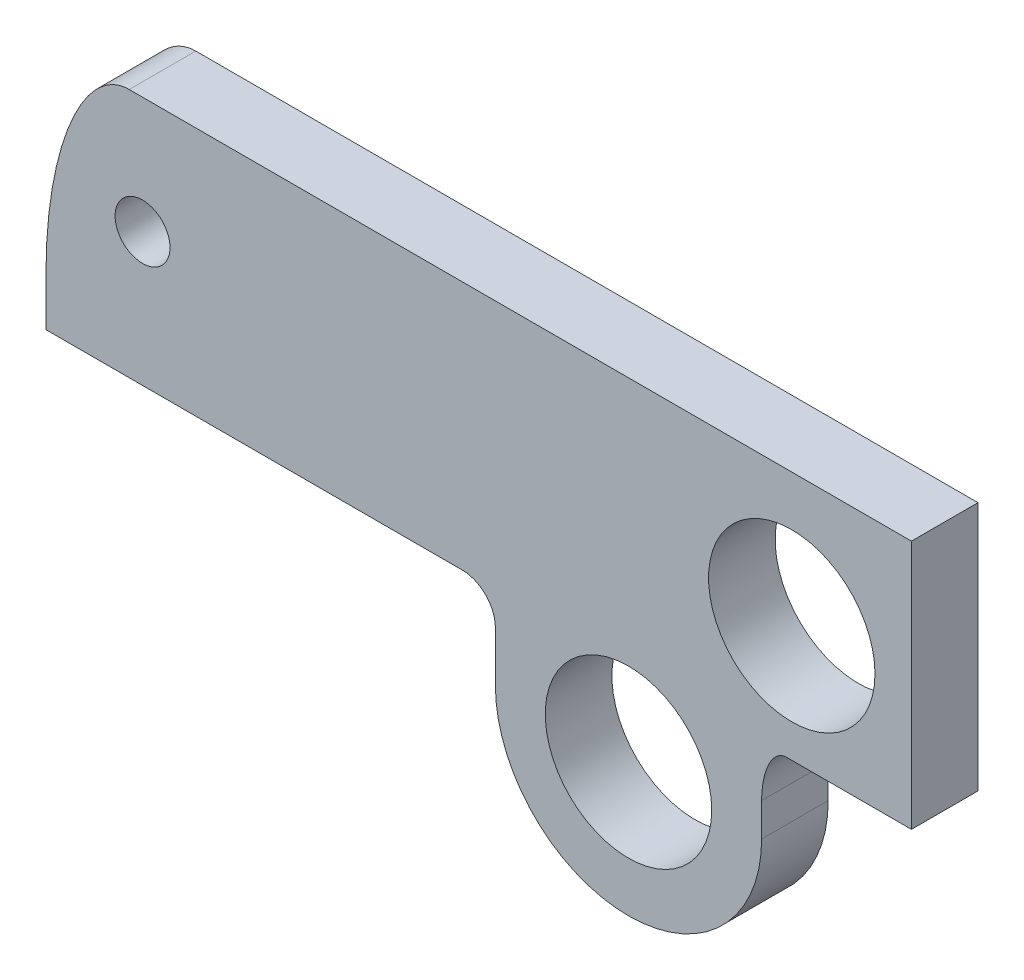
ISO-10303-21;
HEADER;
FILE_DESCRIPTION(('STEP AP214'),'2;1');
FILE_NAME('part.step','',(''),(''),'','','');
FILE_SCHEMA(('AUTOMOTIVE_DESIGN { 1 0 10303 214 1 1 1 1 }'));
ENDSEC;
DATA;
#1=APPLICATION_CONTEXT('core data for automotive mechanical design processes');
#2=APPLICATION_PROTOCOL_DEFINITION('international standard','automotive_design',2000,#1);
#3=PRODUCT_CONTEXT('',#1,'mechanical');
#4=PRODUCT('Part','Part','',(#3));
#5=PRODUCT_RELATED_PRODUCT_CATEGORY('part','',(#4));
#6=PRODUCT_DEFINITION_FORMATION('','',#4);
#7=PRODUCT_DEFINITION_CONTEXT('part definition',#1,'design');
#8=PRODUCT_DEFINITION('design','',#6,#7);
#9=PRODUCT_DEFINITION_SHAPE('','',#8);
#10=(LENGTH_UNIT() NAMED_UNIT(*) SI_UNIT(.MILLI.,.METRE.));
#11=(NAMED_UNIT(*) PLANE_ANGLE_UNIT() SI_UNIT($,.RADIAN.));
#12=(NAMED_UNIT(*) SI_UNIT($,.STERADIAN.) SOLID_ANGLE_UNIT());
#13=UNCERTAINTY_MEASURE_WITH_UNIT(LENGTH_MEASURE(1.E-05),#10,'distance_accuracy_value','');
#14=(GEOMETRIC_REPRESENTATION_CONTEXT(3) GLOBAL_UNCERTAINTY_ASSIGNED_CONTEXT((#13)) GLOBAL_UNIT_ASSIGNED_CONTEXT((#10,
#11,#12)) REPRESENTATION_CONTEXT('',''));
#15=CARTESIAN_POINT('',(0.,0.,0.));
#16=DIRECTION('',(0.,0.,1.));
#17=DIRECTION('',(1.,0.,0.));
#18=AXIS2_PLACEMENT_3D('',#15,#16,#17);
#19=CARTESIAN_POINT('',(25.,0.,4.));
#20=DIRECTION('',(-1.,0.,0.));
#21=DIRECTION('',(0.,-1.,0.));
#22=AXIS2_PLACEMENT_3D('',#19,#20,#21);
#23=PLANE('',#22);
#24=DIRECTION('',(0.,0.,1.));
#25=VECTOR('',#24,1.);
#26=CARTESIAN_POINT('',(25.,13.,-0.0249999999999998));
#27=LINE('',#26,#25);
#28=CARTESIAN_POINT('',(25.,13.,0.));
#29=VERTEX_POINT('',#28);
#30=CARTESIAN_POINT('',(25.,13.,4.));
#31=VERTEX_POINT('',#30);
#32=EDGE_CURVE('E152',#29,#31,#27,.T.);
#33=ORIENTED_EDGE('',*,*,#32,.F.);
#34=DIRECTION('',(0.,1.,0.));
#35=VECTOR('',#34,1.);
#36=CARTESIAN_POINT('',(25.,0.,0.));
#37=LINE('',#36,#35);
#38=CARTESIAN_POINT('',(25.,28.,0.));
#39=VERTEX_POINT('',#38);
#40=EDGE_CURVE('E505',#29,#39,#37,.T.);
#41=ORIENTED_EDGE('',*,*,#40,.T.);
#42=DIRECTION('',(0.,0.,-1.));
#43=VECTOR('',#42,1.);
#44=CARTESIAN_POINT('',(25.,28.,4.));
#45=LINE('',#44,#43);
#46=CARTESIAN_POINT('',(25.,28.,4.));
#47=VERTEX_POINT('',#46);
#48=EDGE_CURVE('E164',#47,#39,#45,.T.);
#49=ORIENTED_EDGE('',*,*,#48,.F.);
#50=DIRECTION('',(0.,1.,0.));
#51=VECTOR('',#50,1.);
#52=CARTESIAN_POINT('',(25.,0.,4.));
#53=LINE('',#52,#51);
#54=EDGE_CURVE('E149',#31,#47,#53,.T.);
#55=ORIENTED_EDGE('',*,*,#54,.F.);
#56=EDGE_LOOP('',(#33,#41,#49,#55));
#57=FACE_BOUND('',#56,.T.);
#58=ADVANCED_FACE('F50',(#57),#23,.F.);
#59=CARTESIAN_POINT('',(0.,0.,4.));
#60=DIRECTION('',(0.,0.,1.));
#61=DIRECTION('',(1.,0.,0.));
#62=AXIS2_PLACEMENT_3D('',#59,#60,#61);
#63=PLANE('',#62);
#64=CARTESIAN_POINT('',(8.,8.,4.));
#65=DIRECTION('',(0.,0.,1.));
#66=DIRECTION('',(1.,0.,0.));
#67=AXIS2_PLACEMENT_3D('',#64,#65,#66);
#68=CIRCLE('',#67,5.);
#69=CARTESIAN_POINT('',(13.,8.,4.));
#70=VERTEX_POINT('',#69);
#71=EDGE_CURVE('E340',#70,#70,#68,.T.);
#72=ORIENTED_EDGE('',*,*,#71,.F.);
#73=EDGE_LOOP('',(#72));
#74=FACE_BOUND('',#73,.T.);
#75=CARTESIAN_POINT('',(-21.2,21.,4.));
#76=DIRECTION('',(0.,0.,1.));
#77=DIRECTION('',(1.,0.,0.));
#78=AXIS2_PLACEMENT_3D('',#75,#76,#77);
#79=CIRCLE('',#78,1.65);
#80=CARTESIAN_POINT('',(-19.55,21.,4.));
#81=VERTEX_POINT('',#80);
#82=EDGE_CURVE('E344',#81,#81,#79,.T.);
#83=ORIENTED_EDGE('',*,*,#82,.F.);
#84=EDGE_LOOP('',(#83));
#85=FACE_BOUND('',#84,.T.);
#86=CARTESIAN_POINT('',(17.8107084351743,20.,4.));
#87=DIRECTION('',(0.,0.,1.));
#88=DIRECTION('',(1.,0.,0.));
#89=AXIS2_PLACEMENT_3D('',#86,#87,#88);
#90=CIRCLE('',#89,5.);
#91=CARTESIAN_POINT('',(22.8107084351743,20.,4.));
#92=VERTEX_POINT('',#91);
#93=EDGE_CURVE('E352',#92,#92,#90,.T.);
#94=ORIENTED_EDGE('',*,*,#93,.F.);
#95=EDGE_LOOP('',(#94));
#96=FACE_BOUND('',#95,.T.);
#97=CARTESIAN_POINT('',(8.,8.,4.));
#98=DIRECTION('',(0.,0.,1.));
#99=DIRECTION('',(1.,0.,0.));
#100=AXIS2_PLACEMENT_3D('',#97,#98,#99);
#101=CIRCLE('',#100,8.);
#102=CARTESIAN_POINT('',(0.,8.,4.));
#103=VERTEX_POINT('',#102);
#104=CARTESIAN_POINT('',(8.,0.,4.));
#105=VERTEX_POINT('',#104);
#106=EDGE_CURVE('E454',#103,#105,#101,.T.);
#107=ORIENTED_EDGE('',*,*,#106,.T.);
#108=CARTESIAN_POINT('',(8.,8.,4.));
#109=DIRECTION('',(0.,0.,1.));
#110=DIRECTION('',(1.,0.,0.));
#111=AXIS2_PLACEMENT_3D('',#108,#109,#110);
#112=CIRCLE('',#111,8.);
#113=CARTESIAN_POINT('',(16.,8.,4.));
#114=VERTEX_POINT('',#113);
#115=EDGE_CURVE('E446',#105,#114,#112,.T.);
#116=ORIENTED_EDGE('',*,*,#115,.T.);
#117=DIRECTION('',(0.,1.,0.));
#118=VECTOR('',#117,1.);
#119=CARTESIAN_POINT('',(16.,0.,4.));
#120=LINE('',#119,#118);
#121=CARTESIAN_POINT('',(16.,9.99999999999999,4.));
#122=VERTEX_POINT('',#121);
#123=EDGE_CURVE('E153',#114,#122,#120,.T.);
#124=ORIENTED_EDGE('',*,*,#123,.T.);
#125=CARTESIAN_POINT('',(17.5,13.,4.));
#126=CARTESIAN_POINT('',(16.,13.,4.));
#127=CARTESIAN_POINT('',(16.,10.,4.));
#128=(BOUNDED_CURVE() B_SPLINE_CURVE(2,(#125,#126,#127),.UNSPECIFIED.,.F.,
.F.) B_SPLINE_CURVE_WITH_KNOTS((3,3),(0.,1.),
.UNSPECIFIED.) CURVE() GEOMETRIC_REPRESENTATION_ITEM() RATIONAL_B_SPLINE_CURVE((1.,
0.707106781186548,1.)) REPRESENTATION_ITEM(''));
#129=CARTESIAN_POINT('',(17.5,13.,4.));
#130=VERTEX_POINT('',#129);
#131=EDGE_CURVE('E65',#122,#130,#128,.F.);
#132=ORIENTED_EDGE('',*,*,#131,.T.);
#133=DIRECTION('',(1.,0.,0.));
#134=VECTOR('',#133,1.);
#135=CARTESIAN_POINT('',(16.,13.,4.));
#136=LINE('',#135,#134);
#137=EDGE_CURVE('E143',#130,#31,#136,.T.);
#138=ORIENTED_EDGE('',*,*,#137,.T.);
#139=ORIENTED_EDGE('',*,*,#54,.T.);
#140=DIRECTION('',(-1.,0.,0.));
#141=VECTOR('',#140,1.);
#142=CARTESIAN_POINT('',(-27.,28.,4.));
#143=LINE('',#142,#141);
#144=CARTESIAN_POINT('',(-22.,28.,4.));
#145=VERTEX_POINT('',#144);
#146=EDGE_CURVE('E167',#47,#145,#143,.T.);
#147=ORIENTED_EDGE('',*,*,#146,.T.);
#148=CARTESIAN_POINT('',(-27.,16.,4.));
#149=CARTESIAN_POINT('',(-27.,28.,4.));
#150=CARTESIAN_POINT('',(-22.,28.,4.));
#151=(BOUNDED_CURVE() B_SPLINE_CURVE(2,(#148,#149,#150),.UNSPECIFIED.,.F.,
.F.) B_SPLINE_CURVE_WITH_KNOTS((3,3),(0.,1.),
.UNSPECIFIED.) CURVE() GEOMETRIC_REPRESENTATION_ITEM() RATIONAL_B_SPLINE_CURVE((1.,
0.707106781186547,1.)) REPRESENTATION_ITEM(''));
#152=CARTESIAN_POINT('',(-27.,16.,4.));
#153=VERTEX_POINT('',#152);
#154=EDGE_CURVE('E308',#145,#153,#151,.F.);
#155=ORIENTED_EDGE('',*,*,#154,.T.);
#156=DIRECTION('',(0.,-1.,0.));
#157=VECTOR('',#156,1.);
#158=CARTESIAN_POINT('',(-27.,28.,4.));
#159=LINE('',#158,#157);
#160=CARTESIAN_POINT('',(-27.,13.,4.));
#161=VERTEX_POINT('',#160);
#162=EDGE_CURVE('E172',#153,#161,#159,.T.);
#163=ORIENTED_EDGE('',*,*,#162,.T.);
#164=DIRECTION('',(1.,0.,0.));
#165=VECTOR('',#164,1.);
#166=CARTESIAN_POINT('',(-27.,13.,4.));
#167=LINE('',#166,#165);
#168=CARTESIAN_POINT('',(-2.,13.,4.));
#169=VERTEX_POINT('',#168);
#170=EDGE_CURVE('E494',#161,#169,#167,.T.);
#171=ORIENTED_EDGE('',*,*,#170,.T.);
#172=CARTESIAN_POINT('',(-2.,11.,4.));
#173=DIRECTION('',(0.,0.,1.));
#174=DIRECTION('',(1.,0.,0.));
#175=AXIS2_PLACEMENT_3D('',#172,#173,#174);
#176=CIRCLE('',#175,2.);
#177=CARTESIAN_POINT('',(0.,11.,4.));
#178=VERTEX_POINT('',#177);
#179=EDGE_CURVE('E314',#169,#178,#176,.F.);
#180=ORIENTED_EDGE('',*,*,#179,.T.);
#181=DIRECTION('',(0.,-1.,0.));
#182=VECTOR('',#181,1.);
#183=CARTESIAN_POINT('',(0.,13.,4.));
#184=LINE('',#183,#182);
#185=EDGE_CURVE('E168',#178,#103,#184,.T.);
#186=ORIENTED_EDGE('',*,*,#185,.T.);
#187=EDGE_LOOP('',(#107,#116,#124,#132,#138,#139,#147,#155,#163,#171,#180,#186));
#188=FACE_BOUND('',#187,.T.);
#189=ADVANCED_FACE('F146',(#74,#85,#96,#188),#63,.T.);
#190=CARTESIAN_POINT('',(0.,0.,0.));
#191=DIRECTION('',(0.,0.,1.));
#192=DIRECTION('',(1.,0.,0.));
#193=AXIS2_PLACEMENT_3D('',#190,#191,#192);
#194=PLANE('',#193);
#195=CARTESIAN_POINT('',(17.8107084351743,20.,0.));
#196=DIRECTION('',(0.,0.,1.));
#197=DIRECTION('',(1.,0.,0.));
#198=AXIS2_PLACEMENT_3D('',#195,#196,#197);
#199=CIRCLE('',#198,5.);
#200=CARTESIAN_POINT('',(22.8107084351743,20.,0.));
#201=VERTEX_POINT('',#200);
#202=EDGE_CURVE('E161',#201,#201,#199,.T.);
#203=ORIENTED_EDGE('',*,*,#202,.T.);
#204=EDGE_LOOP('',(#203));
#205=FACE_BOUND('',#204,.T.);
#206=CARTESIAN_POINT('',(-21.2,21.,0.));
#207=DIRECTION('',(0.,0.,1.));
#208=DIRECTION('',(1.,0.,0.));
#209=AXIS2_PLACEMENT_3D('',#206,#207,#208);
#210=CIRCLE('',#209,1.65);
#211=CARTESIAN_POINT('',(-19.55,21.,0.));
#212=VERTEX_POINT('',#211);
#213=EDGE_CURVE('E348',#212,#212,#210,.T.);
#214=ORIENTED_EDGE('',*,*,#213,.T.);
#215=EDGE_LOOP('',(#214));
#216=FACE_BOUND('',#215,.T.);
#217=CARTESIAN_POINT('',(8.,8.,0.));
#218=DIRECTION('',(0.,0.,1.));
#219=DIRECTION('',(1.,0.,0.));
#220=AXIS2_PLACEMENT_3D('',#217,#218,#219);
#221=CIRCLE('',#220,5.);
#222=CARTESIAN_POINT('',(13.,8.,0.));
#223=VERTEX_POINT('',#222);
#224=EDGE_CURVE('E335',#223,#223,#221,.T.);
#225=ORIENTED_EDGE('',*,*,#224,.T.);
#226=EDGE_LOOP('',(#225));
#227=FACE_BOUND('',#226,.T.);
#228=DIRECTION('',(0.,1.,0.));
#229=VECTOR('',#228,1.);
#230=CARTESIAN_POINT('',(16.,0.,0.));
#231=LINE('',#230,#229);
#232=CARTESIAN_POINT('',(16.,8.,0.));
#233=VERTEX_POINT('',#232);
#234=CARTESIAN_POINT('',(16.,10.,0.));
#235=VERTEX_POINT('',#234);
#236=EDGE_CURVE('E324',#233,#235,#231,.T.);
#237=ORIENTED_EDGE('',*,*,#236,.F.);
#238=CARTESIAN_POINT('',(8.,8.,0.));
#239=DIRECTION('',(0.,0.,1.));
#240=DIRECTION('',(1.,0.,0.));
#241=AXIS2_PLACEMENT_3D('',#238,#239,#240);
#242=CIRCLE('',#241,8.);
#243=CARTESIAN_POINT('',(8.,0.,0.));
#244=VERTEX_POINT('',#243);
#245=EDGE_CURVE('E436',#233,#244,#242,.F.);
#246=ORIENTED_EDGE('',*,*,#245,.T.);
#247=CARTESIAN_POINT('',(8.,8.,0.));
#248=DIRECTION('',(0.,0.,1.));
#249=DIRECTION('',(1.,0.,0.));
#250=AXIS2_PLACEMENT_3D('',#247,#248,#249);
#251=CIRCLE('',#250,8.);
#252=CARTESIAN_POINT('',(0.,8.,0.));
#253=VERTEX_POINT('',#252);
#254=EDGE_CURVE('E463',#244,#253,#251,.F.);
#255=ORIENTED_EDGE('',*,*,#254,.T.);
#256=DIRECTION('',(0.,-1.,0.));
#257=VECTOR('',#256,1.);
#258=CARTESIAN_POINT('',(0.,13.,0.));
#259=LINE('',#258,#257);
#260=CARTESIAN_POINT('',(0.,11.,0.));
#261=VERTEX_POINT('',#260);
#262=EDGE_CURVE('E339',#261,#253,#259,.T.);
#263=ORIENTED_EDGE('',*,*,#262,.F.);
#264=CARTESIAN_POINT('',(-2.,11.,0.));
#265=DIRECTION('',(0.,0.,1.));
#266=DIRECTION('',(1.,0.,0.));
#267=AXIS2_PLACEMENT_3D('',#264,#265,#266);
#268=CIRCLE('',#267,2.);
#269=CARTESIAN_POINT('',(-2.,13.,0.));
#270=VERTEX_POINT('',#269);
#271=EDGE_CURVE('E311',#261,#270,#268,.T.);
#272=ORIENTED_EDGE('',*,*,#271,.T.);
#273=DIRECTION('',(1.,0.,0.));
#274=VECTOR('',#273,1.);
#275=CARTESIAN_POINT('',(-27.,13.,0.));
#276=LINE('',#275,#274);
#277=CARTESIAN_POINT('',(-27.,13.,0.));
#278=VERTEX_POINT('',#277);
#279=EDGE_CURVE('E174',#278,#270,#276,.T.);
#280=ORIENTED_EDGE('',*,*,#279,.F.);
#281=DIRECTION('',(0.,-1.,0.));
#282=VECTOR('',#281,1.);
#283=CARTESIAN_POINT('',(-27.,28.,0.));
#284=LINE('',#283,#282);
#285=CARTESIAN_POINT('',(-27.,16.,0.));
#286=VERTEX_POINT('',#285);
#287=EDGE_CURVE('E479',#286,#278,#284,.T.);
#288=ORIENTED_EDGE('',*,*,#287,.F.);
#289=CARTESIAN_POINT('',(-22.,28.,0.));
#290=CARTESIAN_POINT('',(-27.,28.,0.));
#291=CARTESIAN_POINT('',(-27.,16.,0.));
#292=(BOUNDED_CURVE() B_SPLINE_CURVE(2,(#289,#290,#291),.UNSPECIFIED.,.F.,
.F.) B_SPLINE_CURVE_WITH_KNOTS((3,3),(0.,1.),
.UNSPECIFIED.) CURVE() GEOMETRIC_REPRESENTATION_ITEM() RATIONAL_B_SPLINE_CURVE((1.,
0.707106781186547,1.)) REPRESENTATION_ITEM(''));
#293=CARTESIAN_POINT('',(-22.,28.,0.));
#294=VERTEX_POINT('',#293);
#295=EDGE_CURVE('E514',#286,#294,#292,.F.);
#296=ORIENTED_EDGE('',*,*,#295,.T.);
#297=DIRECTION('',(-1.,0.,0.));
#298=VECTOR('',#297,1.);
#299=CARTESIAN_POINT('',(-27.,28.,0.));
#300=LINE('',#299,#298);
#301=EDGE_CURVE('E483',#39,#294,#300,.T.);
#302=ORIENTED_EDGE('',*,*,#301,.F.);
#303=ORIENTED_EDGE('',*,*,#40,.F.);
#304=DIRECTION('',(1.,0.,0.));
#305=VECTOR('',#304,1.);
#306=CARTESIAN_POINT('',(0.,13.,0.));
#307=LINE('',#306,#305);
#308=CARTESIAN_POINT('',(17.5,13.,0.));
#309=VERTEX_POINT('',#308);
#310=EDGE_CURVE('E157',#309,#29,#307,.T.);
#311=ORIENTED_EDGE('',*,*,#310,.F.);
#312=CARTESIAN_POINT('',(16.,10.,0.));
#313=CARTESIAN_POINT('',(16.,13.,0.));
#314=CARTESIAN_POINT('',(17.5,13.,0.));
#315=(BOUNDED_CURVE() B_SPLINE_CURVE(2,(#312,#313,#314),.UNSPECIFIED.,.F.,
.F.) B_SPLINE_CURVE_WITH_KNOTS((3,3),(0.,1.),
.UNSPECIFIED.) CURVE() GEOMETRIC_REPRESENTATION_ITEM() RATIONAL_B_SPLINE_CURVE((1.,
0.707106781186548,1.)) REPRESENTATION_ITEM(''));
#316=EDGE_CURVE('E12',#309,#235,#315,.F.);
#317=ORIENTED_EDGE('',*,*,#316,.T.);
#318=EDGE_LOOP('',(#237,#246,#255,#263,#272,#280,#288,#296,#302,#303,#311,#317));
#319=FACE_BOUND('',#318,.T.);
#320=ADVANCED_FACE('F216',(#205,#216,#227,#319),#194,.F.);
#321=CARTESIAN_POINT('',(0.,13.,4.));
#322=DIRECTION('',(1.,0.,0.));
#323=DIRECTION('',(0.,0.,-1.));
#324=AXIS2_PLACEMENT_3D('',#321,#322,#323);
#325=PLANE('',#324);
#326=ORIENTED_EDGE('',*,*,#185,.F.);
#327=DIRECTION('',(0.,0.,-1.));
#328=VECTOR('',#327,1.);
#329=CARTESIAN_POINT('',(0.,11.,0.));
#330=LINE('',#329,#328);
#331=EDGE_CURVE('E298',#178,#261,#330,.T.);
#332=ORIENTED_EDGE('',*,*,#331,.T.);
#333=ORIENTED_EDGE('',*,*,#262,.T.);
#334=DIRECTION('',(0.,0.,-1.));
#335=VECTOR('',#334,1.);
#336=CARTESIAN_POINT('',(0.,8.,4.));
#337=LINE('',#336,#335);
#338=EDGE_CURVE('E467',#253,#103,#337,.F.);
#339=ORIENTED_EDGE('',*,*,#338,.T.);
#340=EDGE_LOOP('',(#326,#332,#333,#339));
#341=FACE_BOUND('',#340,.T.);
#342=ADVANCED_FACE('F209',(#341),#325,.F.);
#343=CARTESIAN_POINT('',(-27.,28.,4.));
#344=DIRECTION('',(0.,-1.,0.));
#345=DIRECTION('',(0.,0.,-1.));
#346=AXIS2_PLACEMENT_3D('',#343,#344,#345);
#347=PLANE('',#346);
#348=ORIENTED_EDGE('',*,*,#301,.T.);
#349=CARTESIAN_POINT('',(-22.,28.,4.2));
#350=CARTESIAN_POINT('',(-22.,28.,2.73333333333333));
#351=CARTESIAN_POINT('',(-22.,28.,1.26666666666667));
#352=CARTESIAN_POINT('',(-22.,28.,-0.200000000000001));
#353=(BOUNDED_CURVE() B_SPLINE_CURVE(3,(#349,#350,#351,#352),.UNSPECIFIED.,.F.,
.F.) B_SPLINE_CURVE_WITH_KNOTS((4,4),(-0.0002,0.0042),
.UNSPECIFIED.) CURVE() GEOMETRIC_REPRESENTATION_ITEM() RATIONAL_B_SPLINE_CURVE((1.,1.,1.,1.)) REPRESENTATION_ITEM(''));
#354=EDGE_CURVE('E192',#294,#145,#353,.F.);
#355=ORIENTED_EDGE('',*,*,#354,.T.);
#356=ORIENTED_EDGE('',*,*,#146,.F.);
#357=ORIENTED_EDGE('',*,*,#48,.T.);
#358=EDGE_LOOP('',(#348,#355,#356,#357));
#359=FACE_BOUND('',#358,.T.);
#360=ADVANCED_FACE('F198',(#359),#347,.F.);
#361=CARTESIAN_POINT('',(-27.,28.,4.));
#362=DIRECTION('',(1.,0.,0.));
#363=DIRECTION('',(0.,1.,0.));
#364=AXIS2_PLACEMENT_3D('',#361,#362,#363);
#365=PLANE('',#364);
#366=ORIENTED_EDGE('',*,*,#162,.F.);
#367=CARTESIAN_POINT('',(-27.,16.,-0.200000000000001));
#368=CARTESIAN_POINT('',(-27.,16.,1.26666666666667));
#369=CARTESIAN_POINT('',(-27.,16.,2.73333333333333));
#370=CARTESIAN_POINT('',(-27.,16.,4.2));
#371=(BOUNDED_CURVE() B_SPLINE_CURVE(3,(#367,#368,#369,#370),.UNSPECIFIED.,.F.,
.F.) B_SPLINE_CURVE_WITH_KNOTS((4,4),(-0.0002,0.0042),
.UNSPECIFIED.) CURVE() GEOMETRIC_REPRESENTATION_ITEM() RATIONAL_B_SPLINE_CURVE((1.,1.,1.,1.)) REPRESENTATION_ITEM(''));
#372=EDGE_CURVE('E478',#153,#286,#371,.F.);
#373=ORIENTED_EDGE('',*,*,#372,.T.);
#374=ORIENTED_EDGE('',*,*,#287,.T.);
#375=DIRECTION('',(0.,0.,-1.));
#376=VECTOR('',#375,1.);
#377=CARTESIAN_POINT('',(-27.,13.,4.));
#378=LINE('',#377,#376);
#379=EDGE_CURVE('E469',#161,#278,#378,.T.);
#380=ORIENTED_EDGE('',*,*,#379,.F.);
#381=EDGE_LOOP('',(#366,#373,#374,#380));
#382=FACE_BOUND('',#381,.T.);
#383=ADVANCED_FACE('F208',(#382),#365,.F.);
#384=CARTESIAN_POINT('',(-27.,13.,4.));
#385=DIRECTION('',(0.,1.,0.));
#386=DIRECTION('',(0.,0.,1.));
#387=AXIS2_PLACEMENT_3D('',#384,#385,#386);
#388=PLANE('',#387);
#389=ORIENTED_EDGE('',*,*,#279,.T.);
#390=DIRECTION('',(0.,0.,-1.));
#391=VECTOR('',#390,1.);
#392=CARTESIAN_POINT('',(-2.,13.,4.));
#393=LINE('',#392,#391);
#394=EDGE_CURVE('E307',#270,#169,#393,.F.);
#395=ORIENTED_EDGE('',*,*,#394,.T.);
#396=ORIENTED_EDGE('',*,*,#170,.F.);
#397=ORIENTED_EDGE('',*,*,#379,.T.);
#398=EDGE_LOOP('',(#389,#395,#396,#397));
#399=FACE_BOUND('',#398,.T.);
#400=ADVANCED_FACE('F222',(#399),#388,.F.);
#401=CARTESIAN_POINT('',(8.,8.,4.));
#402=DIRECTION('',(0.,0.,-1.));
#403=DIRECTION('',(-1.,0.,0.));
#404=AXIS2_PLACEMENT_3D('',#401,#402,#403);
#405=CYLINDRICAL_SURFACE('',#404,8.);
#406=ORIENTED_EDGE('',*,*,#106,.F.);
#407=ORIENTED_EDGE('',*,*,#338,.F.);
#408=ORIENTED_EDGE('',*,*,#254,.F.);
#409=DIRECTION('',(0.,0.,-1.));
#410=VECTOR('',#409,1.);
#411=CARTESIAN_POINT('',(8.,0.,4.));
#412=LINE('',#411,#410);
#413=EDGE_CURVE('E461',#105,#244,#412,.T.);
#414=ORIENTED_EDGE('',*,*,#413,.F.);
#415=EDGE_LOOP('',(#406,#407,#408,#414));
#416=FACE_BOUND('',#415,.T.);
#417=ADVANCED_FACE('F218',(#416),#405,.T.);
#418=CARTESIAN_POINT('',(17.8107084351743,20.,0.));
#419=DIRECTION('',(0.,0.,1.));
#420=DIRECTION('',(1.,0.,0.));
#421=AXIS2_PLACEMENT_3D('',#418,#419,#420);
#422=CYLINDRICAL_SURFACE('',#421,5.);
#423=ORIENTED_EDGE('',*,*,#202,.F.);
#424=EDGE_LOOP('',(#423));
#425=FACE_BOUND('',#424,.T.);
#426=ORIENTED_EDGE('',*,*,#93,.T.);
#427=EDGE_LOOP('',(#426));
#428=FACE_BOUND('',#427,.T.);
#429=ADVANCED_FACE('F221',(#425,#428),#422,.F.);
#430=CARTESIAN_POINT('',(-21.2,21.,0.));
#431=DIRECTION('',(0.,0.,1.));
#432=DIRECTION('',(1.,0.,0.));
#433=AXIS2_PLACEMENT_3D('',#430,#431,#432);
#434=CYLINDRICAL_SURFACE('',#433,1.65);
#435=ORIENTED_EDGE('',*,*,#213,.F.);
#436=EDGE_LOOP('',(#435));
#437=FACE_BOUND('',#436,.T.);
#438=ORIENTED_EDGE('',*,*,#82,.T.);
#439=EDGE_LOOP('',(#438));
#440=FACE_BOUND('',#439,.T.);
#441=ADVANCED_FACE('F363',(#437,#440),#434,.F.);
#442=CARTESIAN_POINT('',(8.,8.,0.));
#443=DIRECTION('',(0.,0.,1.));
#444=DIRECTION('',(1.,0.,0.));
#445=AXIS2_PLACEMENT_3D('',#442,#443,#444);
#446=CYLINDRICAL_SURFACE('',#445,5.);
#447=ORIENTED_EDGE('',*,*,#224,.F.);
#448=EDGE_LOOP('',(#447));
#449=FACE_BOUND('',#448,.T.);
#450=ORIENTED_EDGE('',*,*,#71,.T.);
#451=EDGE_LOOP('',(#450));
#452=FACE_BOUND('',#451,.T.);
#453=ADVANCED_FACE('F234',(#449,#452),#446,.F.);
#454=CARTESIAN_POINT('',(-27.,16.,4.2));
#455=CARTESIAN_POINT('',(-27.,16.,2.73333333333333));
#456=CARTESIAN_POINT('',(-27.,16.,1.26666666666667));
#457=CARTESIAN_POINT('',(-27.,16.,-0.200000000000001));
#458=CARTESIAN_POINT('',(-27.,28.,4.2));
#459=CARTESIAN_POINT('',(-27.,28.,2.73333333333333));
#460=CARTESIAN_POINT('',(-27.,28.,1.26666666666667));
#461=CARTESIAN_POINT('',(-27.,28.,-0.200000000000001));
#462=CARTESIAN_POINT('',(-22.,28.,4.2));
#463=CARTESIAN_POINT('',(-22.,28.,2.73333333333333));
#464=CARTESIAN_POINT('',(-22.,28.,1.26666666666667));
#465=CARTESIAN_POINT('',(-22.,28.,-0.200000000000001));
#466=(BOUNDED_SURFACE() B_SPLINE_SURFACE(2,3,((#454,#455,#456,#457),(#458,#459,#460,#461),(#462,
#463,#464,#465)),.UNSPECIFIED.,.F.,.F.,.F.) B_SPLINE_SURFACE_WITH_KNOTS((3,3),(4,4),(0.,1.),
(-0.0002,0.0042),.UNSPECIFIED.) GEOMETRIC_REPRESENTATION_ITEM() RATIONAL_B_SPLINE_SURFACE(((1.,
1.,1.,1.),(0.707106781186547,0.707106781186547,0.707106781186547,0.707106781186547),(1.,1.,1.,1.))) REPRESENTATION_ITEM('') SURFACE());
#467=ORIENTED_EDGE('',*,*,#154,.F.);
#468=ORIENTED_EDGE('',*,*,#354,.F.);
#469=ORIENTED_EDGE('',*,*,#295,.F.);
#470=ORIENTED_EDGE('',*,*,#372,.F.);
#471=EDGE_LOOP('',(#467,#468,#469,#470));
#472=FACE_BOUND('',#471,.T.);
#473=ADVANCED_FACE('F225',(#472),#466,.T.);
#474=CARTESIAN_POINT('',(-2.,11.,4.));
#475=DIRECTION('',(0.,0.,1.));
#476=DIRECTION('',(1.,0.,0.));
#477=AXIS2_PLACEMENT_3D('',#474,#475,#476);
#478=CYLINDRICAL_SURFACE('',#477,2.);
#479=ORIENTED_EDGE('',*,*,#179,.F.);
#480=ORIENTED_EDGE('',*,*,#394,.F.);
#481=ORIENTED_EDGE('',*,*,#271,.F.);
#482=ORIENTED_EDGE('',*,*,#331,.F.);
#483=EDGE_LOOP('',(#479,#480,#481,#482));
#484=FACE_BOUND('',#483,.T.);
#485=ADVANCED_FACE('F233',(#484),#478,.F.);
#486=CARTESIAN_POINT('',(16.,0.,-0.0249999999999998));
#487=DIRECTION('',(1.,0.,0.));
#488=DIRECTION('',(0.,0.,-1.));
#489=AXIS2_PLACEMENT_3D('',#486,#487,#488);
#490=PLANE('',#489);
#491=ORIENTED_EDGE('',*,*,#236,.T.);
#492=CARTESIAN_POINT('',(16.,10.,4.2));
#493=CARTESIAN_POINT('',(16.,10.,2.73333333333333));
#494=CARTESIAN_POINT('',(16.,10.,1.26666666666667));
#495=CARTESIAN_POINT('',(16.,10.,-0.200000000000001));
#496=(BOUNDED_CURVE() B_SPLINE_CURVE(3,(#492,#493,#494,#495),.UNSPECIFIED.,.F.,
.F.) B_SPLINE_CURVE_WITH_KNOTS((4,4),(-0.004225,0.000175),
.UNSPECIFIED.) CURVE() GEOMETRIC_REPRESENTATION_ITEM() RATIONAL_B_SPLINE_CURVE((1.,1.,1.,1.)) REPRESENTATION_ITEM(''));
#497=EDGE_CURVE('E416',#235,#122,#496,.F.);
#498=ORIENTED_EDGE('',*,*,#497,.T.);
#499=ORIENTED_EDGE('',*,*,#123,.F.);
#500=DIRECTION('',(0.,0.,1.));
#501=VECTOR('',#500,1.);
#502=CARTESIAN_POINT('',(16.,8.,0.));
#503=LINE('',#502,#501);
#504=EDGE_CURVE('E440',#114,#233,#503,.F.);
#505=ORIENTED_EDGE('',*,*,#504,.T.);
#506=EDGE_LOOP('',(#491,#498,#499,#505));
#507=FACE_BOUND('',#506,.T.);
#508=ADVANCED_FACE('F459',(#507),#490,.T.);
#509=CARTESIAN_POINT('',(16.,13.,-0.0249999999999998));
#510=DIRECTION('',(0.,-1.,0.));
#511=DIRECTION('',(0.,0.,-1.));
#512=AXIS2_PLACEMENT_3D('',#509,#510,#511);
#513=PLANE('',#512);
#514=ORIENTED_EDGE('',*,*,#137,.F.);
#515=CARTESIAN_POINT('',(17.5,13.,-0.200000000000001));
#516=CARTESIAN_POINT('',(17.5,13.,1.26666666666667));
#517=CARTESIAN_POINT('',(17.5,13.,2.73333333333333));
#518=CARTESIAN_POINT('',(17.5,13.,4.2));
#519=(BOUNDED_CURVE() B_SPLINE_CURVE(3,(#515,#516,#517,#518),.UNSPECIFIED.,.F.,
.F.) B_SPLINE_CURVE_WITH_KNOTS((4,4),(-0.004225,0.000175),
.UNSPECIFIED.) CURVE() GEOMETRIC_REPRESENTATION_ITEM() RATIONAL_B_SPLINE_CURVE((1.,1.,1.,1.)) REPRESENTATION_ITEM(''));
#520=EDGE_CURVE('E79',#130,#309,#519,.F.);
#521=ORIENTED_EDGE('',*,*,#520,.T.);
#522=ORIENTED_EDGE('',*,*,#310,.T.);
#523=ORIENTED_EDGE('',*,*,#32,.T.);
#524=EDGE_LOOP('',(#514,#521,#522,#523));
#525=FACE_BOUND('',#524,.T.);
#526=ADVANCED_FACE('F156',(#525),#513,.T.);
#527=CARTESIAN_POINT('',(8.,8.,4.));
#528=DIRECTION('',(0.,0.,-1.));
#529=DIRECTION('',(-1.,0.,0.));
#530=AXIS2_PLACEMENT_3D('',#527,#528,#529);
#531=CYLINDRICAL_SURFACE('',#530,8.);
#532=ORIENTED_EDGE('',*,*,#245,.F.);
#533=ORIENTED_EDGE('',*,*,#504,.F.);
#534=ORIENTED_EDGE('',*,*,#115,.F.);
#535=ORIENTED_EDGE('',*,*,#413,.T.);
#536=EDGE_LOOP('',(#532,#533,#534,#535));
#537=FACE_BOUND('',#536,.T.);
#538=ADVANCED_FACE('F460',(#537),#531,.T.);
#539=CARTESIAN_POINT('',(17.5,13.,4.2));
#540=CARTESIAN_POINT('',(17.5,13.,2.73333333333333));
#541=CARTESIAN_POINT('',(17.5,13.,1.26666666666667));
#542=CARTESIAN_POINT('',(17.5,13.,-0.200000000000001));
#543=CARTESIAN_POINT('',(16.,13.,4.2));
#544=CARTESIAN_POINT('',(16.,13.,2.73333333333333));
#545=CARTESIAN_POINT('',(16.,13.,1.26666666666667));
#546=CARTESIAN_POINT('',(16.,13.,-0.200000000000001));
#547=CARTESIAN_POINT('',(16.,10.,4.2));
#548=CARTESIAN_POINT('',(16.,10.,2.73333333333333));
#549=CARTESIAN_POINT('',(16.,10.,1.26666666666667));
#550=CARTESIAN_POINT('',(16.,10.,-0.200000000000001));
#551=(BOUNDED_SURFACE() B_SPLINE_SURFACE(2,3,((#539,#540,#541,#542),(#543,#544,#545,#546),(#547,
#548,#549,#550)),.UNSPECIFIED.,.F.,.F.,.F.) B_SPLINE_SURFACE_WITH_KNOTS((3,3),(4,4),(0.,1.),
(-0.004225,0.000175),
.UNSPECIFIED.) GEOMETRIC_REPRESENTATION_ITEM() RATIONAL_B_SPLINE_SURFACE(((1.,1.,1.,1.),
(0.707106781186548,0.707106781186548,0.707106781186548,0.707106781186548),(1.,1.,1.,1.))) REPRESENTATION_ITEM('') SURFACE());
#552=ORIENTED_EDGE('',*,*,#316,.F.);
#553=ORIENTED_EDGE('',*,*,#520,.F.);
#554=ORIENTED_EDGE('',*,*,#131,.F.);
#555=ORIENTED_EDGE('',*,*,#497,.F.);
#556=EDGE_LOOP('',(#552,#553,#554,#555));
#557=FACE_BOUND('',#556,.T.);
#558=ADVANCED_FACE('F53',(#557),#551,.T.);
#559=CLOSED_SHELL('',(#58,#189,#320,#342,#360,#383,#400,#417,#429,#441,#453,#473,#485,#508,#526,
#538,#558));
#560=MANIFOLD_SOLID_BREP('B2',#559);
#561=ADVANCED_BREP_SHAPE_REPRESENTATION('',(#18,#560),#14);
#562=SHAPE_DEFINITION_REPRESENTATION(#9,#561);
ENDSEC;
END-ISO-10303-21;
